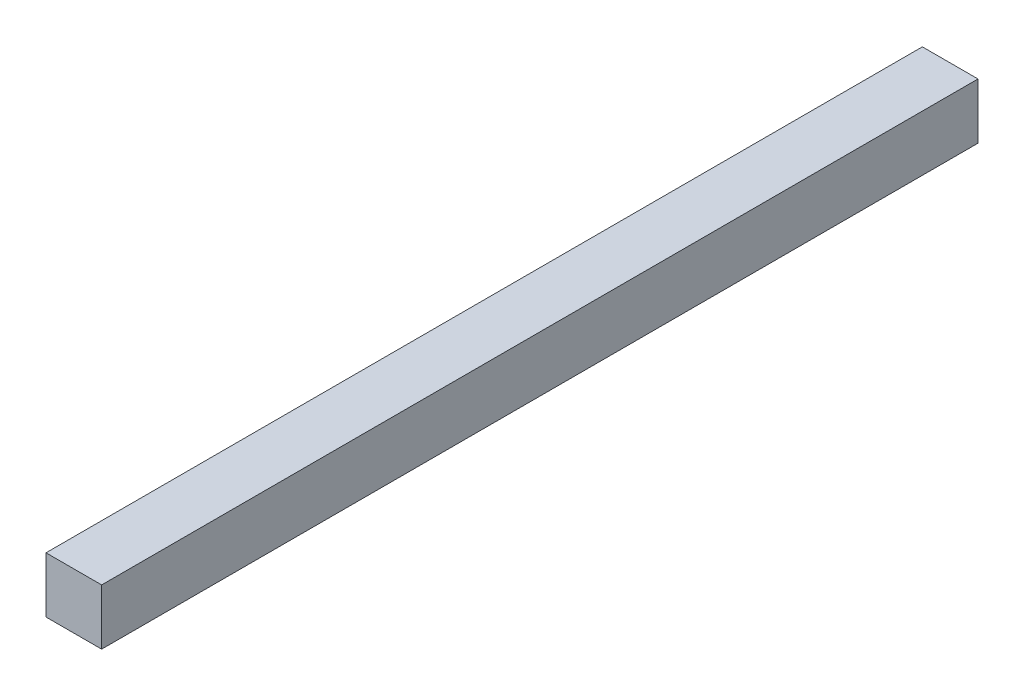
ISO-10303-21;
HEADER;
FILE_DESCRIPTION(('STEP AP214'),'2;1');
FILE_NAME('part.step','',(''),(''),'','','');
FILE_SCHEMA(('AUTOMOTIVE_DESIGN { 1 0 10303 214 1 1 1 1 }'));
ENDSEC;
DATA;
#1=APPLICATION_CONTEXT('core data for automotive mechanical design processes');
#2=APPLICATION_PROTOCOL_DEFINITION('international standard','automotive_design',2000,#1);
#3=PRODUCT_CONTEXT('',#1,'mechanical');
#4=PRODUCT('Part','Part','',(#3));
#5=PRODUCT_RELATED_PRODUCT_CATEGORY('part','',(#4));
#6=PRODUCT_DEFINITION_FORMATION('','',#4);
#7=PRODUCT_DEFINITION_CONTEXT('part definition',#1,'design');
#8=PRODUCT_DEFINITION('design','',#6,#7);
#9=PRODUCT_DEFINITION_SHAPE('','',#8);
#10=(LENGTH_UNIT() NAMED_UNIT(*) SI_UNIT(.MILLI.,.METRE.));
#11=(NAMED_UNIT(*) PLANE_ANGLE_UNIT() SI_UNIT($,.RADIAN.));
#12=(NAMED_UNIT(*) SI_UNIT($,.STERADIAN.) SOLID_ANGLE_UNIT());
#13=UNCERTAINTY_MEASURE_WITH_UNIT(LENGTH_MEASURE(1.E-05),#10,'distance_accuracy_value','');
#14=(GEOMETRIC_REPRESENTATION_CONTEXT(3) GLOBAL_UNCERTAINTY_ASSIGNED_CONTEXT((#13)) GLOBAL_UNIT_ASSIGNED_CONTEXT((#10,
#11,#12)) REPRESENTATION_CONTEXT('',''));
#15=CARTESIAN_POINT('',(0.,0.,0.));
#16=DIRECTION('',(0.,0.,1.));
#17=DIRECTION('',(1.,0.,0.));
#18=AXIS2_PLACEMENT_3D('',#15,#16,#17);
#19=CARTESIAN_POINT('',(-1.5875,1.5875,50.));
#20=DIRECTION('',(1.,0.,0.));
#21=DIRECTION('',(0.,1.,0.));
#22=AXIS2_PLACEMENT_3D('',#19,#20,#21);
#23=PLANE('',#22);
#24=DIRECTION('',(0.,-1.,0.));
#25=VECTOR('',#24,1.);
#26=CARTESIAN_POINT('',(-1.5875,1.5875,0.));
#27=LINE('',#26,#25);
#28=CARTESIAN_POINT('',(-1.5875,1.5875,0.));
#29=VERTEX_POINT('',#28);
#30=CARTESIAN_POINT('',(-1.5875,-1.5875,0.));
#31=VERTEX_POINT('',#30);
#32=EDGE_CURVE('E107',#29,#31,#27,.T.);
#33=ORIENTED_EDGE('',*,*,#32,.T.);
#34=DIRECTION('',(0.,0.,-1.));
#35=VECTOR('',#34,1.);
#36=CARTESIAN_POINT('',(-1.5875,-1.5875,50.));
#37=LINE('',#36,#35);
#38=CARTESIAN_POINT('',(-1.5875,-1.5875,50.));
#39=VERTEX_POINT('',#38);
#40=EDGE_CURVE('E11',#39,#31,#37,.T.);
#41=ORIENTED_EDGE('',*,*,#40,.F.);
#42=DIRECTION('',(0.,-1.,0.));
#43=VECTOR('',#42,1.);
#44=CARTESIAN_POINT('',(-1.5875,1.5875,50.));
#45=LINE('',#44,#43);
#46=CARTESIAN_POINT('',(-1.5875,1.5875,50.));
#47=VERTEX_POINT('',#46);
#48=EDGE_CURVE('E91',#47,#39,#45,.T.);
#49=ORIENTED_EDGE('',*,*,#48,.F.);
#50=DIRECTION('',(0.,0.,-1.));
#51=VECTOR('',#50,1.);
#52=CARTESIAN_POINT('',(-1.5875,1.5875,50.));
#53=LINE('',#52,#51);
#54=EDGE_CURVE('E103',#47,#29,#53,.T.);
#55=ORIENTED_EDGE('',*,*,#54,.T.);
#56=EDGE_LOOP('',(#33,#41,#49,#55));
#57=FACE_BOUND('',#56,.T.);
#58=ADVANCED_FACE('F39',(#57),#23,.F.);
#59=CARTESIAN_POINT('',(1.5875,-1.5875,50.));
#60=DIRECTION('',(0.,1.,0.));
#61=DIRECTION('',(-1.,0.,0.));
#62=AXIS2_PLACEMENT_3D('',#59,#60,#61);
#63=PLANE('',#62);
#64=DIRECTION('',(1.,0.,0.));
#65=VECTOR('',#64,1.);
#66=CARTESIAN_POINT('',(1.5875,-1.5875,0.));
#67=LINE('',#66,#65);
#68=CARTESIAN_POINT('',(1.5875,-1.5875,0.));
#69=VERTEX_POINT('',#68);
#70=EDGE_CURVE('E96',#31,#69,#67,.T.);
#71=ORIENTED_EDGE('',*,*,#70,.T.);
#72=DIRECTION('',(0.,0.,-1.));
#73=VECTOR('',#72,1.);
#74=CARTESIAN_POINT('',(1.5875,-1.5875,50.));
#75=LINE('',#74,#73);
#76=CARTESIAN_POINT('',(1.5875,-1.5875,50.));
#77=VERTEX_POINT('',#76);
#78=EDGE_CURVE('E48',#77,#69,#75,.T.);
#79=ORIENTED_EDGE('',*,*,#78,.F.);
#80=DIRECTION('',(1.,0.,0.));
#81=VECTOR('',#80,1.);
#82=CARTESIAN_POINT('',(1.5875,-1.5875,50.));
#83=LINE('',#82,#81);
#84=EDGE_CURVE('E86',#39,#77,#83,.T.);
#85=ORIENTED_EDGE('',*,*,#84,.F.);
#86=ORIENTED_EDGE('',*,*,#40,.T.);
#87=EDGE_LOOP('',(#71,#79,#85,#86));
#88=FACE_BOUND('',#87,.T.);
#89=ADVANCED_FACE('F95',(#88),#63,.F.);
#90=CARTESIAN_POINT('',(1.5875,1.5875,50.));
#91=DIRECTION('',(-1.,0.,0.));
#92=DIRECTION('',(0.,-1.,0.));
#93=AXIS2_PLACEMENT_3D('',#90,#91,#92);
#94=PLANE('',#93);
#95=DIRECTION('',(0.,1.,0.));
#96=VECTOR('',#95,1.);
#97=CARTESIAN_POINT('',(1.5875,1.5875,0.));
#98=LINE('',#97,#96);
#99=CARTESIAN_POINT('',(1.5875,1.5875,0.));
#100=VERTEX_POINT('',#99);
#101=EDGE_CURVE('E73',#69,#100,#98,.T.);
#102=ORIENTED_EDGE('',*,*,#101,.T.);
#103=DIRECTION('',(0.,0.,-1.));
#104=VECTOR('',#103,1.);
#105=CARTESIAN_POINT('',(1.5875,1.5875,50.));
#106=LINE('',#105,#104);
#107=CARTESIAN_POINT('',(1.5875,1.5875,50.));
#108=VERTEX_POINT('',#107);
#109=EDGE_CURVE('E98',#108,#100,#106,.T.);
#110=ORIENTED_EDGE('',*,*,#109,.F.);
#111=DIRECTION('',(0.,1.,0.));
#112=VECTOR('',#111,1.);
#113=CARTESIAN_POINT('',(1.5875,1.5875,50.));
#114=LINE('',#113,#112);
#115=EDGE_CURVE('E89',#77,#108,#114,.T.);
#116=ORIENTED_EDGE('',*,*,#115,.F.);
#117=ORIENTED_EDGE('',*,*,#78,.T.);
#118=EDGE_LOOP('',(#102,#110,#116,#117));
#119=FACE_BOUND('',#118,.T.);
#120=ADVANCED_FACE('F99',(#119),#94,.F.);
#121=CARTESIAN_POINT('',(1.5875,1.5875,50.));
#122=DIRECTION('',(0.,-1.,0.));
#123=DIRECTION('',(1.,0.,0.));
#124=AXIS2_PLACEMENT_3D('',#121,#122,#123);
#125=PLANE('',#124);
#126=DIRECTION('',(-1.,0.,0.));
#127=VECTOR('',#126,1.);
#128=CARTESIAN_POINT('',(1.5875,1.5875,0.));
#129=LINE('',#128,#127);
#130=EDGE_CURVE('E79',#100,#29,#129,.T.);
#131=ORIENTED_EDGE('',*,*,#130,.T.);
#132=ORIENTED_EDGE('',*,*,#54,.F.);
#133=DIRECTION('',(-1.,0.,0.));
#134=VECTOR('',#133,1.);
#135=CARTESIAN_POINT('',(1.5875,1.5875,50.));
#136=LINE('',#135,#134);
#137=EDGE_CURVE('E56',#108,#47,#136,.T.);
#138=ORIENTED_EDGE('',*,*,#137,.F.);
#139=ORIENTED_EDGE('',*,*,#109,.T.);
#140=EDGE_LOOP('',(#131,#132,#138,#139));
#141=FACE_BOUND('',#140,.T.);
#142=ADVANCED_FACE('F120',(#141),#125,.F.);
#143=CARTESIAN_POINT('',(0.,0.,50.));
#144=DIRECTION('',(0.,0.,-1.));
#145=DIRECTION('',(-1.,0.,0.));
#146=AXIS2_PLACEMENT_3D('',#143,#144,#145);
#147=PLANE('',#146);
#148=ORIENTED_EDGE('',*,*,#48,.T.);
#149=ORIENTED_EDGE('',*,*,#84,.T.);
#150=ORIENTED_EDGE('',*,*,#115,.T.);
#151=ORIENTED_EDGE('',*,*,#137,.T.);
#152=EDGE_LOOP('',(#148,#149,#150,#151));
#153=FACE_BOUND('',#152,.T.);
#154=ADVANCED_FACE('F87',(#153),#147,.F.);
#155=CARTESIAN_POINT('',(0.,0.,0.));
#156=DIRECTION('',(0.,0.,-1.));
#157=DIRECTION('',(-1.,0.,0.));
#158=AXIS2_PLACEMENT_3D('',#155,#156,#157);
#159=PLANE('',#158);
#160=ORIENTED_EDGE('',*,*,#32,.F.);
#161=ORIENTED_EDGE('',*,*,#130,.F.);
#162=ORIENTED_EDGE('',*,*,#101,.F.);
#163=ORIENTED_EDGE('',*,*,#70,.F.);
#164=EDGE_LOOP('',(#160,#161,#162,#163));
#165=FACE_BOUND('',#164,.T.);
#166=ADVANCED_FACE('F123',(#165),#159,.T.);
#167=CLOSED_SHELL('',(#58,#89,#120,#142,#154,#166));
#168=MANIFOLD_SOLID_BREP('B2',#167);
#169=ADVANCED_BREP_SHAPE_REPRESENTATION('',(#18,#168),#14);
#170=SHAPE_DEFINITION_REPRESENTATION(#9,#169);
ENDSEC;
END-ISO-10303-21;
